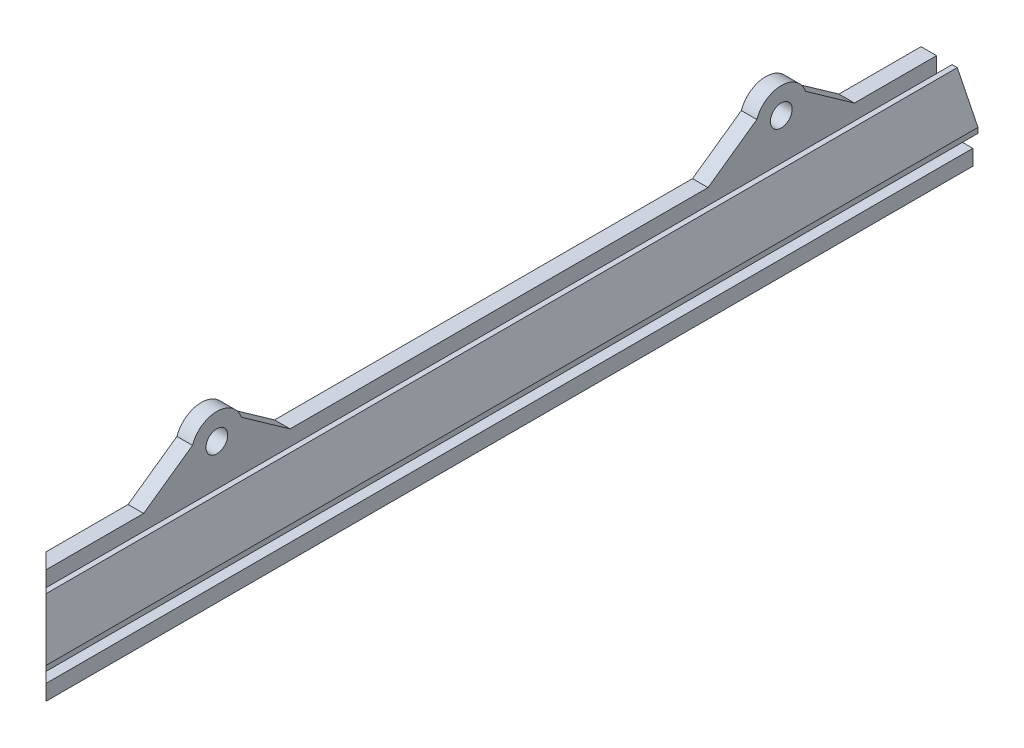
ISO-10303-21;
HEADER;
FILE_DESCRIPTION(('STEP AP214'),'2;1');
FILE_NAME('part.step','',(''),(''),'','','');
FILE_SCHEMA(('AUTOMOTIVE_DESIGN { 1 0 10303 214 1 1 1 1 }'));
ENDSEC;
DATA;
#1=APPLICATION_CONTEXT('core data for automotive mechanical design processes');
#2=APPLICATION_PROTOCOL_DEFINITION('international standard','automotive_design',2000,#1);
#3=PRODUCT_CONTEXT('',#1,'mechanical');
#4=PRODUCT('Part','Part','',(#3));
#5=PRODUCT_RELATED_PRODUCT_CATEGORY('part','',(#4));
#6=PRODUCT_DEFINITION_FORMATION('','',#4);
#7=PRODUCT_DEFINITION_CONTEXT('part definition',#1,'design');
#8=PRODUCT_DEFINITION('design','',#6,#7);
#9=PRODUCT_DEFINITION_SHAPE('','',#8);
#10=(LENGTH_UNIT() NAMED_UNIT(*) SI_UNIT(.MILLI.,.METRE.));
#11=(NAMED_UNIT(*) PLANE_ANGLE_UNIT() SI_UNIT($,.RADIAN.));
#12=(NAMED_UNIT(*) SI_UNIT($,.STERADIAN.) SOLID_ANGLE_UNIT());
#13=UNCERTAINTY_MEASURE_WITH_UNIT(LENGTH_MEASURE(1.E-05),#10,'distance_accuracy_value','');
#14=(GEOMETRIC_REPRESENTATION_CONTEXT(3) GLOBAL_UNCERTAINTY_ASSIGNED_CONTEXT((#13)) GLOBAL_UNIT_ASSIGNED_CONTEXT((#10,
#11,#12)) REPRESENTATION_CONTEXT('',''));
#15=CARTESIAN_POINT('',(0.,0.,0.));
#16=DIRECTION('',(0.,0.,1.));
#17=DIRECTION('',(1.,0.,0.));
#18=AXIS2_PLACEMENT_3D('',#15,#16,#17);
#19=CARTESIAN_POINT('',(0.,15.,180.));
#20=DIRECTION('',(0.,-1.,0.));
#21=DIRECTION('',(0.,0.,-1.));
#22=AXIS2_PLACEMENT_3D('',#19,#20,#21);
#23=PLANE('',#22);
#24=DIRECTION('',(0.,0.,-1.));
#25=VECTOR('',#24,1.);
#26=CARTESIAN_POINT('',(3.,15.,180.));
#27=LINE('',#26,#25);
#28=CARTESIAN_POINT('',(2.99999999999998,15.,172.));
#29=VERTEX_POINT('',#28);
#30=CARTESIAN_POINT('',(3.,15.,153.142135623731));
#31=VERTEX_POINT('',#30);
#32=EDGE_CURVE('E308',#29,#31,#27,.T.);
#33=ORIENTED_EDGE('',*,*,#32,.T.);
#34=DIRECTION('',(-1.,0.,0.));
#35=VECTOR('',#34,1.);
#36=CARTESIAN_POINT('',(0.,15.,153.142135623731));
#37=LINE('',#36,#35);
#38=CARTESIAN_POINT('',(0.,15.,153.142135623731));
#39=VERTEX_POINT('',#38);
#40=EDGE_CURVE('E239',#31,#39,#37,.T.);
#41=ORIENTED_EDGE('',*,*,#40,.T.);
#42=DIRECTION('',(0.,0.,-1.));
#43=VECTOR('',#42,1.);
#44=CARTESIAN_POINT('',(0.,15.,180.));
#45=LINE('',#44,#43);
#46=CARTESIAN_POINT('',(0.,15.,169.));
#47=VERTEX_POINT('',#46);
#48=EDGE_CURVE('E298',#47,#39,#45,.T.);
#49=ORIENTED_EDGE('',*,*,#48,.F.);
#50=DIRECTION('',(-0.707106781186551,0.,-0.707106781186544));
#51=VECTOR('',#50,1.);
#52=CARTESIAN_POINT('',(-84.5,15.,84.5000000000009));
#53=LINE('',#52,#51);
#54=EDGE_CURVE('E196',#29,#47,#53,.T.);
#55=ORIENTED_EDGE('',*,*,#54,.F.);
#56=EDGE_LOOP('',(#33,#41,#49,#55));
#57=FACE_BOUND('',#56,.T.);
#58=ADVANCED_FACE('F47',(#57),#23,.F.);
#59=CARTESIAN_POINT('',(0.,15.,124.857864376269));
#60=VERTEX_POINT('',#59);
#61=CARTESIAN_POINT('',(0.,15.,44.1421356237311));
#62=VERTEX_POINT('',#61);
#63=EDGE_CURVE('E295',#60,#62,#45,.T.);
#64=ORIENTED_EDGE('',*,*,#63,.F.);
#65=DIRECTION('',(1.,0.,0.));
#66=VECTOR('',#65,1.);
#67=CARTESIAN_POINT('',(0.,15.,124.857864376269));
#68=LINE('',#67,#66);
#69=CARTESIAN_POINT('',(3.,15.,124.857864376269));
#70=VERTEX_POINT('',#69);
#71=EDGE_CURVE('E224',#60,#70,#68,.T.);
#72=ORIENTED_EDGE('',*,*,#71,.T.);
#73=CARTESIAN_POINT('',(3.,15.,44.1421356237311));
#74=VERTEX_POINT('',#73);
#75=EDGE_CURVE('E307',#70,#74,#27,.T.);
#76=ORIENTED_EDGE('',*,*,#75,.T.);
#77=DIRECTION('',(-1.,0.,0.));
#78=VECTOR('',#77,1.);
#79=CARTESIAN_POINT('',(0.,15.,44.1421356237311));
#80=LINE('',#79,#78);
#81=EDGE_CURVE('E219',#74,#62,#80,.T.);
#82=ORIENTED_EDGE('',*,*,#81,.T.);
#83=EDGE_LOOP('',(#64,#72,#76,#82));
#84=FACE_BOUND('',#83,.T.);
#85=ADVANCED_FACE('F469',(#84),#23,.F.);
#86=CARTESIAN_POINT('',(0.,0.,180.));
#87=DIRECTION('',(1.,0.,0.));
#88=DIRECTION('',(0.,0.,-1.));
#89=AXIS2_PLACEMENT_3D('',#86,#87,#88);
#90=PLANE('',#89);
#91=ORIENTED_EDGE('',*,*,#48,.T.);
#92=DIRECTION('',(0.,0.577350269189619,-0.816496580927731));
#93=VECTOR('',#92,1.);
#94=CARTESIAN_POINT('',(0.,-2.66091868576533,178.118446353109));
#95=LINE('',#94,#93);
#96=CARTESIAN_POINT('',(0.,21.6666666666667,143.71404520791));
#97=VERTEX_POINT('',#96);
#98=EDGE_CURVE('E258',#39,#97,#95,.T.);
#99=ORIENTED_EDGE('',*,*,#98,.T.);
#100=CARTESIAN_POINT('',(0.,20.,139.));
#101=DIRECTION('',(-1.,0.,0.));
#102=DIRECTION('',(0.,0.,1.));
#103=AXIS2_PLACEMENT_3D('',#100,#101,#102);
#104=CIRCLE('',#103,4.99999999999998);
#105=CARTESIAN_POINT('',(0.,21.6666666666667,134.28595479209));
#106=VERTEX_POINT('',#105);
#107=EDGE_CURVE('E449',#97,#106,#104,.T.);
#108=ORIENTED_EDGE('',*,*,#107,.T.);
#109=DIRECTION('',(0.,0.577350269189619,0.816496580927731));
#110=VECTOR('',#109,1.);
#111=CARTESIAN_POINT('',(0.,35.994252019099,154.548220313558));
#112=LINE('',#111,#110);
#113=EDGE_CURVE('E255',#106,#60,#112,.F.);
#114=ORIENTED_EDGE('',*,*,#113,.T.);
#115=ORIENTED_EDGE('',*,*,#63,.T.);
#116=DIRECTION('',(0.,0.577350269189619,-0.816496580927731));
#117=VECTOR('',#116,1.);
#118=CARTESIAN_POINT('',(0.,-54.0440114519875,141.785113019777));
#119=LINE('',#118,#117);
#120=CARTESIAN_POINT('',(0.,21.6666666666667,34.7140452079103));
#121=VERTEX_POINT('',#120);
#122=EDGE_CURVE('E264',#62,#121,#119,.T.);
#123=ORIENTED_EDGE('',*,*,#122,.T.);
#124=CARTESIAN_POINT('',(0.,20.,30.));
#125=DIRECTION('',(-1.,0.,0.));
#126=DIRECTION('',(0.,0.,1.));
#127=AXIS2_PLACEMENT_3D('',#124,#125,#126);
#128=CIRCLE('',#127,5.);
#129=CARTESIAN_POINT('',(0.,21.6666666666667,25.2859547920897));
#130=VERTEX_POINT('',#129);
#131=EDGE_CURVE('E286',#121,#130,#128,.T.);
#132=ORIENTED_EDGE('',*,*,#131,.T.);
#133=DIRECTION('',(0.,0.577350269189619,0.816496580927731));
#134=VECTOR('',#133,1.);
#135=CARTESIAN_POINT('',(0.,87.3773447853212,118.214886980225));
#136=LINE('',#135,#134);
#137=CARTESIAN_POINT('',(0.,15.,15.8578643762689));
#138=VERTEX_POINT('',#137);
#139=EDGE_CURVE('E11',#130,#138,#136,.F.);
#140=ORIENTED_EDGE('',*,*,#139,.T.);
#141=CARTESIAN_POINT('',(0.,15.,0.));
#142=VERTEX_POINT('',#141);
#143=EDGE_CURVE('E291',#138,#142,#45,.T.);
#144=ORIENTED_EDGE('',*,*,#143,.T.);
#145=DIRECTION('',(0.,-1.,0.));
#146=VECTOR('',#145,1.);
#147=CARTESIAN_POINT('',(0.,0.,0.));
#148=LINE('',#147,#146);
#149=CARTESIAN_POINT('',(0.,0.,0.));
#150=VERTEX_POINT('',#149);
#151=EDGE_CURVE('E217',#142,#150,#148,.T.);
#152=ORIENTED_EDGE('',*,*,#151,.T.);
#153=DIRECTION('',(0.,0.,-1.));
#154=VECTOR('',#153,1.);
#155=CARTESIAN_POINT('',(0.,0.,180.));
#156=LINE('',#155,#154);
#157=CARTESIAN_POINT('',(0.,0.,169.));
#158=VERTEX_POINT('',#157);
#159=EDGE_CURVE('E207',#158,#150,#156,.T.);
#160=ORIENTED_EDGE('',*,*,#159,.F.);
#161=DIRECTION('',(0.,1.,0.));
#162=VECTOR('',#161,1.);
#163=CARTESIAN_POINT('',(0.,0.,169.));
#164=LINE('',#163,#162);
#165=EDGE_CURVE('E190',#158,#47,#164,.T.);
#166=ORIENTED_EDGE('',*,*,#165,.T.);
#167=EDGE_LOOP('',(#91,#99,#108,#114,#115,#123,#132,#140,#144,#152,#160,#166));
#168=FACE_BOUND('',#167,.T.);
#169=CARTESIAN_POINT('',(0.,20.,30.));
#170=DIRECTION('',(-1.,0.,0.));
#171=DIRECTION('',(0.,0.,1.));
#172=AXIS2_PLACEMENT_3D('',#169,#170,#171);
#173=CIRCLE('',#172,2.1);
#174=CARTESIAN_POINT('',(0.,20.,32.1));
#175=VERTEX_POINT('',#174);
#176=EDGE_CURVE('E437',#175,#175,#173,.T.);
#177=ORIENTED_EDGE('',*,*,#176,.F.);
#178=EDGE_LOOP('',(#177));
#179=FACE_BOUND('',#178,.T.);
#180=CARTESIAN_POINT('',(0.,20.,139.));
#181=DIRECTION('',(-1.,0.,0.));
#182=DIRECTION('',(0.,0.,1.));
#183=AXIS2_PLACEMENT_3D('',#180,#181,#182);
#184=CIRCLE('',#183,2.09999999999999);
#185=CARTESIAN_POINT('',(0.,20.,141.1));
#186=VERTEX_POINT('',#185);
#187=EDGE_CURVE('E441',#186,#186,#184,.T.);
#188=ORIENTED_EDGE('',*,*,#187,.F.);
#189=EDGE_LOOP('',(#188));
#190=FACE_BOUND('',#189,.T.);
#191=ADVANCED_FACE('F214',(#168,#179,#190),#90,.F.);
#192=CARTESIAN_POINT('',(0.,0.,180.));
#193=DIRECTION('',(0.,1.,0.));
#194=DIRECTION('',(0.,0.,1.));
#195=AXIS2_PLACEMENT_3D('',#192,#193,#194);
#196=PLANE('',#195);
#197=DIRECTION('',(0.,0.,-1.));
#198=VECTOR('',#197,1.);
#199=CARTESIAN_POINT('',(10.,0.,180.));
#200=LINE('',#199,#198);
#201=CARTESIAN_POINT('',(10.,0.,179.));
#202=VERTEX_POINT('',#201);
#203=CARTESIAN_POINT('',(10.,0.,0.));
#204=VERTEX_POINT('',#203);
#205=EDGE_CURVE('E209',#202,#204,#200,.T.);
#206=ORIENTED_EDGE('',*,*,#205,.F.);
#207=DIRECTION('',(-0.707106781186551,0.,-0.707106781186544));
#208=VECTOR('',#207,1.);
#209=CARTESIAN_POINT('',(-84.5,0.,84.5000000000009));
#210=LINE('',#209,#208);
#211=EDGE_CURVE('E193',#202,#158,#210,.T.);
#212=ORIENTED_EDGE('',*,*,#211,.T.);
#213=ORIENTED_EDGE('',*,*,#159,.T.);
#214=DIRECTION('',(1.,0.,0.));
#215=VECTOR('',#214,1.);
#216=CARTESIAN_POINT('',(0.,0.,0.));
#217=LINE('',#216,#215);
#218=EDGE_CURVE('E363',#150,#204,#217,.T.);
#219=ORIENTED_EDGE('',*,*,#218,.T.);
#220=EDGE_LOOP('',(#206,#212,#213,#219));
#221=FACE_BOUND('',#220,.T.);
#222=ADVANCED_FACE('F205',(#221),#196,.F.);
#223=CARTESIAN_POINT('',(10.,0.,180.));
#224=DIRECTION('',(-1.,0.,0.));
#225=DIRECTION('',(0.,0.,1.));
#226=AXIS2_PLACEMENT_3D('',#223,#224,#225);
#227=PLANE('',#226);
#228=DIRECTION('',(0.,0.,-1.));
#229=VECTOR('',#228,1.);
#230=CARTESIAN_POINT('',(10.,3.,180.));
#231=LINE('',#230,#229);
#232=CARTESIAN_POINT('',(10.,3.,179.));
#233=VERTEX_POINT('',#232);
#234=CARTESIAN_POINT('',(10.,3.,0.));
#235=VERTEX_POINT('',#234);
#236=EDGE_CURVE('E226',#233,#235,#231,.T.);
#237=ORIENTED_EDGE('',*,*,#236,.F.);
#238=DIRECTION('',(0.,-1.,0.));
#239=VECTOR('',#238,1.);
#240=CARTESIAN_POINT('',(10.,0.,179.));
#241=LINE('',#240,#239);
#242=EDGE_CURVE('E402',#233,#202,#241,.T.);
#243=ORIENTED_EDGE('',*,*,#242,.T.);
#244=ORIENTED_EDGE('',*,*,#205,.T.);
#245=DIRECTION('',(0.,1.,0.));
#246=VECTOR('',#245,1.);
#247=CARTESIAN_POINT('',(10.,0.,0.));
#248=LINE('',#247,#246);
#249=EDGE_CURVE('E359',#204,#235,#248,.T.);
#250=ORIENTED_EDGE('',*,*,#249,.T.);
#251=EDGE_LOOP('',(#237,#243,#244,#250));
#252=FACE_BOUND('',#251,.T.);
#253=ADVANCED_FACE('F360',(#252),#227,.F.);
#254=CARTESIAN_POINT('',(10.,3.,180.));
#255=DIRECTION('',(0.,-1.,0.));
#256=DIRECTION('',(1.,0.,0.));
#257=AXIS2_PLACEMENT_3D('',#254,#255,#256);
#258=PLANE('',#257);
#259=DIRECTION('',(0.,0.,-1.));
#260=VECTOR('',#259,1.);
#261=CARTESIAN_POINT('',(3.,3.,180.));
#262=LINE('',#261,#260);
#263=CARTESIAN_POINT('',(3.,3.,172.));
#264=VERTEX_POINT('',#263);
#265=CARTESIAN_POINT('',(3.,3.,0.));
#266=VERTEX_POINT('',#265);
#267=EDGE_CURVE('E343',#264,#266,#262,.T.);
#268=ORIENTED_EDGE('',*,*,#267,.F.);
#269=DIRECTION('',(0.707106781186551,0.,0.707106781186544));
#270=VECTOR('',#269,1.);
#271=CARTESIAN_POINT('',(10.5,3.,179.5));
#272=LINE('',#271,#270);
#273=EDGE_CURVE('E356',#264,#233,#272,.T.);
#274=ORIENTED_EDGE('',*,*,#273,.T.);
#275=ORIENTED_EDGE('',*,*,#236,.T.);
#276=DIRECTION('',(-1.,0.,0.));
#277=VECTOR('',#276,1.);
#278=CARTESIAN_POINT('',(10.,3.,0.));
#279=LINE('',#278,#277);
#280=EDGE_CURVE('E354',#235,#266,#279,.T.);
#281=ORIENTED_EDGE('',*,*,#280,.T.);
#282=EDGE_LOOP('',(#268,#274,#275,#281));
#283=FACE_BOUND('',#282,.T.);
#284=ADVANCED_FACE('F352',(#283),#258,.F.);
#285=CARTESIAN_POINT('',(3.,3.,180.));
#286=DIRECTION('',(-1.,0.,0.));
#287=DIRECTION('',(0.,-1.,0.));
#288=AXIS2_PLACEMENT_3D('',#285,#286,#287);
#289=PLANE('',#288);
#290=DIRECTION('',(0.,0.,-1.));
#291=VECTOR('',#290,1.);
#292=CARTESIAN_POINT('',(3.,6.,180.));
#293=LINE('',#292,#291);
#294=CARTESIAN_POINT('',(3.,6.,172.));
#295=VERTEX_POINT('',#294);
#296=CARTESIAN_POINT('',(3.,6.,0.));
#297=VERTEX_POINT('',#296);
#298=EDGE_CURVE('E340',#295,#297,#293,.T.);
#299=ORIENTED_EDGE('',*,*,#298,.F.);
#300=DIRECTION('',(0.,-1.,0.));
#301=VECTOR('',#300,1.);
#302=CARTESIAN_POINT('',(3.,3.,172.));
#303=LINE('',#302,#301);
#304=EDGE_CURVE('E410',#295,#264,#303,.T.);
#305=ORIENTED_EDGE('',*,*,#304,.T.);
#306=ORIENTED_EDGE('',*,*,#267,.T.);
#307=DIRECTION('',(0.,1.,0.));
#308=VECTOR('',#307,1.);
#309=CARTESIAN_POINT('',(3.,3.,0.));
#310=LINE('',#309,#308);
#311=EDGE_CURVE('E368',#266,#297,#310,.T.);
#312=ORIENTED_EDGE('',*,*,#311,.T.);
#313=EDGE_LOOP('',(#299,#305,#306,#312));
#314=FACE_BOUND('',#313,.T.);
#315=ADVANCED_FACE('F524',(#314),#289,.F.);
#316=CARTESIAN_POINT('',(3.,6.,180.));
#317=DIRECTION('',(0.,1.,0.));
#318=DIRECTION('',(-1.,0.,0.));
#319=AXIS2_PLACEMENT_3D('',#316,#317,#318);
#320=PLANE('',#319);
#321=DIRECTION('',(0.,0.,-1.));
#322=VECTOR('',#321,1.);
#323=CARTESIAN_POINT('',(11.,6.,180.));
#324=LINE('',#323,#322);
#325=CARTESIAN_POINT('',(11.,6.,180.));
#326=VERTEX_POINT('',#325);
#327=CARTESIAN_POINT('',(11.,6.,0.));
#328=VERTEX_POINT('',#327);
#329=EDGE_CURVE('E336',#326,#328,#324,.T.);
#330=ORIENTED_EDGE('',*,*,#329,.F.);
#331=DIRECTION('',(-0.707106781186551,0.,-0.707106781186544));
#332=VECTOR('',#331,1.);
#333=CARTESIAN_POINT('',(6.99999999999997,6.,176.));
#334=LINE('',#333,#332);
#335=EDGE_CURVE('E414',#326,#295,#334,.T.);
#336=ORIENTED_EDGE('',*,*,#335,.T.);
#337=ORIENTED_EDGE('',*,*,#298,.T.);
#338=DIRECTION('',(1.,0.,0.));
#339=VECTOR('',#338,1.);
#340=CARTESIAN_POINT('',(3.,6.,0.));
#341=LINE('',#340,#339);
#342=EDGE_CURVE('E372',#297,#328,#341,.T.);
#343=ORIENTED_EDGE('',*,*,#342,.T.);
#344=EDGE_LOOP('',(#330,#336,#337,#343));
#345=FACE_BOUND('',#344,.T.);
#346=ADVANCED_FACE('F520',(#345),#320,.F.);
#347=CARTESIAN_POINT('',(11.,7.,180.));
#348=DIRECTION('',(-1.,0.,0.));
#349=DIRECTION('',(0.,0.,1.));
#350=AXIS2_PLACEMENT_3D('',#347,#348,#349);
#351=PLANE('',#350);
#352=DIRECTION('',(0.,1.,0.));
#353=VECTOR('',#352,1.);
#354=CARTESIAN_POINT('',(11.,7.,0.));
#355=LINE('',#354,#353);
#356=CARTESIAN_POINT('',(11.,7.,0.));
#357=VERTEX_POINT('',#356);
#358=EDGE_CURVE('E378',#328,#357,#355,.T.);
#359=ORIENTED_EDGE('',*,*,#358,.T.);
#360=DIRECTION('',(0.,0.,-1.));
#361=VECTOR('',#360,1.);
#362=CARTESIAN_POINT('',(11.,7.,180.));
#363=LINE('',#362,#361);
#364=CARTESIAN_POINT('',(11.,7.,180.));
#365=VERTEX_POINT('',#364);
#366=EDGE_CURVE('E332',#365,#357,#363,.T.);
#367=ORIENTED_EDGE('',*,*,#366,.F.);
#368=DIRECTION('',(0.,1.,0.));
#369=VECTOR('',#368,1.);
#370=CARTESIAN_POINT('',(11.,7.,180.));
#371=LINE('',#370,#369);
#372=EDGE_CURVE('E296',#326,#365,#371,.T.);
#373=ORIENTED_EDGE('',*,*,#372,.F.);
#374=ORIENTED_EDGE('',*,*,#329,.T.);
#375=EDGE_LOOP('',(#359,#367,#373,#374));
#376=FACE_BOUND('',#375,.T.);
#377=ADVANCED_FACE('F516',(#376),#351,.F.);
#378=CARTESIAN_POINT('',(7.,15.,180.));
#379=DIRECTION('',(-0.894427190999916,-0.447213595499958,0.));
#380=DIRECTION('',(0.447213595499958,-0.894427190999916,0.));
#381=AXIS2_PLACEMENT_3D('',#378,#379,#380);
#382=PLANE('',#381);
#383=DIRECTION('',(0.,0.,-1.));
#384=VECTOR('',#383,1.);
#385=CARTESIAN_POINT('',(7.,15.,180.));
#386=LINE('',#385,#384);
#387=CARTESIAN_POINT('',(7.00000000000001,15.,176.));
#388=VERTEX_POINT('',#387);
#389=CARTESIAN_POINT('',(7.,15.,0.));
#390=VERTEX_POINT('',#389);
#391=EDGE_CURVE('E329',#388,#390,#386,.T.);
#392=ORIENTED_EDGE('',*,*,#391,.F.);
#393=DIRECTION('',(0.408248290463864,-0.816496580927727,0.408248290463859));
#394=VECTOR('',#393,1.);
#395=CARTESIAN_POINT('',(7.66666666666666,13.6666666666667,176.666666666667));
#396=LINE('',#395,#394);
#397=EDGE_CURVE('E418',#388,#365,#396,.T.);
#398=ORIENTED_EDGE('',*,*,#397,.T.);
#399=ORIENTED_EDGE('',*,*,#366,.T.);
#400=DIRECTION('',(-0.447213595499958,0.894427190999916,0.));
#401=VECTOR('',#400,1.);
#402=CARTESIAN_POINT('',(7.,15.,0.));
#403=LINE('',#402,#401);
#404=EDGE_CURVE('E381',#357,#390,#403,.T.);
#405=ORIENTED_EDGE('',*,*,#404,.T.);
#406=EDGE_LOOP('',(#392,#398,#399,#405));
#407=FACE_BOUND('',#406,.T.);
#408=ADVANCED_FACE('F512',(#407),#382,.F.);
#409=CARTESIAN_POINT('',(6.,15.,180.));
#410=DIRECTION('',(0.,-1.,0.));
#411=DIRECTION('',(0.,0.,-1.));
#412=AXIS2_PLACEMENT_3D('',#409,#410,#411);
#413=PLANE('',#412);
#414=DIRECTION('',(0.,0.,-1.));
#415=VECTOR('',#414,1.);
#416=CARTESIAN_POINT('',(6.,15.,180.));
#417=LINE('',#416,#415);
#418=CARTESIAN_POINT('',(6.00000000000002,15.,175.));
#419=VERTEX_POINT('',#418);
#420=CARTESIAN_POINT('',(6.,15.,0.));
#421=VERTEX_POINT('',#420);
#422=EDGE_CURVE('E324',#419,#421,#417,.T.);
#423=ORIENTED_EDGE('',*,*,#422,.F.);
#424=EDGE_CURVE('E211',#388,#419,#53,.T.);
#425=ORIENTED_EDGE('',*,*,#424,.F.);
#426=ORIENTED_EDGE('',*,*,#391,.T.);
#427=DIRECTION('',(-1.,0.,0.));
#428=VECTOR('',#427,1.);
#429=CARTESIAN_POINT('',(6.,15.,0.));
#430=LINE('',#429,#428);
#431=EDGE_CURVE('E385',#390,#421,#430,.T.);
#432=ORIENTED_EDGE('',*,*,#431,.T.);
#433=EDGE_LOOP('',(#423,#425,#426,#432));
#434=FACE_BOUND('',#433,.T.);
#435=ADVANCED_FACE('F508',(#434),#413,.F.);
#436=CARTESIAN_POINT('',(6.,9.,180.));
#437=DIRECTION('',(1.,0.,0.));
#438=DIRECTION('',(0.,0.,-1.));
#439=AXIS2_PLACEMENT_3D('',#436,#437,#438);
#440=PLANE('',#439);
#441=DIRECTION('',(0.,0.,-1.));
#442=VECTOR('',#441,1.);
#443=CARTESIAN_POINT('',(6.,9.,180.));
#444=LINE('',#443,#442);
#445=CARTESIAN_POINT('',(6.,9.,175.));
#446=VERTEX_POINT('',#445);
#447=CARTESIAN_POINT('',(6.,9.,0.));
#448=VERTEX_POINT('',#447);
#449=EDGE_CURVE('E319',#446,#448,#444,.T.);
#450=ORIENTED_EDGE('',*,*,#449,.F.);
#451=DIRECTION('',(0.,1.,0.));
#452=VECTOR('',#451,1.);
#453=CARTESIAN_POINT('',(6.,9.,175.));
#454=LINE('',#453,#452);
#455=EDGE_CURVE('E422',#446,#419,#454,.T.);
#456=ORIENTED_EDGE('',*,*,#455,.T.);
#457=ORIENTED_EDGE('',*,*,#422,.T.);
#458=DIRECTION('',(0.,-1.,0.));
#459=VECTOR('',#458,1.);
#460=CARTESIAN_POINT('',(6.,9.,0.));
#461=LINE('',#460,#459);
#462=EDGE_CURVE('E389',#421,#448,#461,.T.);
#463=ORIENTED_EDGE('',*,*,#462,.T.);
#464=EDGE_LOOP('',(#450,#456,#457,#463));
#465=FACE_BOUND('',#464,.T.);
#466=ADVANCED_FACE('F502',(#465),#440,.F.);
#467=CARTESIAN_POINT('',(3.,9.,180.));
#468=DIRECTION('',(0.,-1.,0.));
#469=DIRECTION('',(0.,0.,-1.));
#470=AXIS2_PLACEMENT_3D('',#467,#468,#469);
#471=PLANE('',#470);
#472=DIRECTION('',(0.,0.,-1.));
#473=VECTOR('',#472,1.);
#474=CARTESIAN_POINT('',(3.,9.,180.));
#475=LINE('',#474,#473);
#476=CARTESIAN_POINT('',(3.,9.,172.));
#477=VERTEX_POINT('',#476);
#478=CARTESIAN_POINT('',(3.,9.,0.));
#479=VERTEX_POINT('',#478);
#480=EDGE_CURVE('E314',#477,#479,#475,.T.);
#481=ORIENTED_EDGE('',*,*,#480,.F.);
#482=DIRECTION('',(0.707106781186551,0.,0.707106781186544));
#483=VECTOR('',#482,1.);
#484=CARTESIAN_POINT('',(6.99999999999998,9.,176.));
#485=LINE('',#484,#483);
#486=EDGE_CURVE('E426',#477,#446,#485,.T.);
#487=ORIENTED_EDGE('',*,*,#486,.T.);
#488=ORIENTED_EDGE('',*,*,#449,.T.);
#489=DIRECTION('',(-1.,0.,0.));
#490=VECTOR('',#489,1.);
#491=CARTESIAN_POINT('',(3.,9.,0.));
#492=LINE('',#491,#490);
#493=EDGE_CURVE('E393',#448,#479,#492,.T.);
#494=ORIENTED_EDGE('',*,*,#493,.T.);
#495=EDGE_LOOP('',(#481,#487,#488,#494));
#496=FACE_BOUND('',#495,.T.);
#497=ADVANCED_FACE('F497',(#496),#471,.F.);
#498=CARTESIAN_POINT('',(3.,15.,180.));
#499=DIRECTION('',(-1.,0.,0.));
#500=DIRECTION('',(0.,-1.,0.));
#501=AXIS2_PLACEMENT_3D('',#498,#499,#500);
#502=PLANE('',#501);
#503=ORIENTED_EDGE('',*,*,#75,.F.);
#504=DIRECTION('',(0.,-0.577350269189619,-0.816496580927731));
#505=VECTOR('',#504,1.);
#506=CARTESIAN_POINT('',(3.,40.9942520190988,161.619288125423));
#507=LINE('',#506,#505);
#508=CARTESIAN_POINT('',(3.,21.6666666666667,134.28595479209));
#509=VERTEX_POINT('',#508);
#510=EDGE_CURVE('E252',#70,#509,#507,.F.);
#511=ORIENTED_EDGE('',*,*,#510,.T.);
#512=CARTESIAN_POINT('',(3.,20.,139.));
#513=DIRECTION('',(-1.,0.,0.));
#514=DIRECTION('',(0.,0.,1.));
#515=AXIS2_PLACEMENT_3D('',#512,#513,#514);
#516=CIRCLE('',#515,4.99999999999998);
#517=CARTESIAN_POINT('',(3.,21.6666666666667,143.71404520791));
#518=VERTEX_POINT('',#517);
#519=EDGE_CURVE('E453',#518,#509,#516,.T.);
#520=ORIENTED_EDGE('',*,*,#519,.F.);
#521=DIRECTION('',(0.,-0.577350269189619,0.816496580927731));
#522=VECTOR('',#521,1.);
#523=CARTESIAN_POINT('',(3.,2.33908131423456,171.047378541244));
#524=LINE('',#523,#522);
#525=EDGE_CURVE('E261',#518,#31,#524,.T.);
#526=ORIENTED_EDGE('',*,*,#525,.T.);
#527=ORIENTED_EDGE('',*,*,#32,.F.);
#528=DIRECTION('',(0.,-1.,0.));
#529=VECTOR('',#528,1.);
#530=CARTESIAN_POINT('',(3.,15.,172.));
#531=LINE('',#530,#529);
#532=EDGE_CURVE('E201',#29,#477,#531,.T.);
#533=ORIENTED_EDGE('',*,*,#532,.T.);
#534=ORIENTED_EDGE('',*,*,#480,.T.);
#535=DIRECTION('',(0.,1.,0.));
#536=VECTOR('',#535,1.);
#537=CARTESIAN_POINT('',(3.,15.,0.));
#538=LINE('',#537,#536);
#539=CARTESIAN_POINT('',(3.,15.,0.));
#540=VERTEX_POINT('',#539);
#541=EDGE_CURVE('E396',#479,#540,#538,.T.);
#542=ORIENTED_EDGE('',*,*,#541,.T.);
#543=CARTESIAN_POINT('',(3.,15.,15.8578643762689));
#544=VERTEX_POINT('',#543);
#545=EDGE_CURVE('E280',#544,#540,#27,.T.);
#546=ORIENTED_EDGE('',*,*,#545,.F.);
#547=DIRECTION('',(0.,-0.577350269189619,-0.816496580927731));
#548=VECTOR('',#547,1.);
#549=CARTESIAN_POINT('',(2.99999999999999,92.377344785321,125.285954792091));
#550=LINE('',#549,#548);
#551=CARTESIAN_POINT('',(3.,21.6666666666667,25.2859547920897));
#552=VERTEX_POINT('',#551);
#553=EDGE_CURVE('E57',#544,#552,#550,.F.);
#554=ORIENTED_EDGE('',*,*,#553,.T.);
#555=CARTESIAN_POINT('',(3.,20.,30.));
#556=DIRECTION('',(-1.,0.,0.));
#557=DIRECTION('',(0.,0.,1.));
#558=AXIS2_PLACEMENT_3D('',#555,#556,#557);
#559=CIRCLE('',#558,5.);
#560=CARTESIAN_POINT('',(3.,21.6666666666667,34.7140452079103));
#561=VERTEX_POINT('',#560);
#562=EDGE_CURVE('E277',#561,#552,#559,.T.);
#563=ORIENTED_EDGE('',*,*,#562,.F.);
#564=DIRECTION('',(0.,-0.577350269189619,0.816496580927731));
#565=VECTOR('',#564,1.);
#566=CARTESIAN_POINT('',(3.00000000000001,-49.0440114519877,134.714045207911));
#567=LINE('',#566,#565);
#568=EDGE_CURVE('E267',#561,#74,#567,.T.);
#569=ORIENTED_EDGE('',*,*,#568,.T.);
#570=EDGE_LOOP('',(#503,#511,#520,#526,#527,#533,#534,#542,#546,#554,#563,#569));
#571=FACE_BOUND('',#570,.T.);
#572=CARTESIAN_POINT('',(3.,20.,30.));
#573=DIRECTION('',(-1.,0.,0.));
#574=DIRECTION('',(0.,0.,1.));
#575=AXIS2_PLACEMENT_3D('',#572,#573,#574);
#576=CIRCLE('',#575,2.1);
#577=CARTESIAN_POINT('',(3.,20.,32.1));
#578=VERTEX_POINT('',#577);
#579=EDGE_CURVE('E435',#578,#578,#576,.T.);
#580=ORIENTED_EDGE('',*,*,#579,.T.);
#581=EDGE_LOOP('',(#580));
#582=FACE_BOUND('',#581,.T.);
#583=CARTESIAN_POINT('',(3.,20.,139.));
#584=DIRECTION('',(-1.,0.,0.));
#585=DIRECTION('',(0.,0.,1.));
#586=AXIS2_PLACEMENT_3D('',#583,#584,#585);
#587=CIRCLE('',#586,2.09999999999999);
#588=CARTESIAN_POINT('',(3.,20.,141.1));
#589=VERTEX_POINT('',#588);
#590=EDGE_CURVE('E445',#589,#589,#587,.T.);
#591=ORIENTED_EDGE('',*,*,#590,.T.);
#592=EDGE_LOOP('',(#591));
#593=FACE_BOUND('',#592,.T.);
#594=ADVANCED_FACE('F275',(#571,#582,#593),#502,.F.);
#595=ORIENTED_EDGE('',*,*,#143,.F.);
#596=DIRECTION('',(1.,0.,0.));
#597=VECTOR('',#596,1.);
#598=CARTESIAN_POINT('',(0.,15.,15.8578643762689));
#599=LINE('',#598,#597);
#600=EDGE_CURVE('E249',#138,#544,#599,.T.);
#601=ORIENTED_EDGE('',*,*,#600,.T.);
#602=ORIENTED_EDGE('',*,*,#545,.T.);
#603=DIRECTION('',(-1.,0.,0.));
#604=VECTOR('',#603,1.);
#605=CARTESIAN_POINT('',(0.,15.,0.));
#606=LINE('',#605,#604);
#607=EDGE_CURVE('E293',#540,#142,#606,.T.);
#608=ORIENTED_EDGE('',*,*,#607,.T.);
#609=EDGE_LOOP('',(#595,#601,#602,#608));
#610=FACE_BOUND('',#609,.T.);
#611=ADVANCED_FACE('F289',(#610),#23,.F.);
#612=CARTESIAN_POINT('',(0.,0.,0.));
#613=DIRECTION('',(0.,0.,-1.));
#614=DIRECTION('',(-1.,0.,0.));
#615=AXIS2_PLACEMENT_3D('',#612,#613,#614);
#616=PLANE('',#615);
#617=ORIENTED_EDGE('',*,*,#151,.F.);
#618=ORIENTED_EDGE('',*,*,#607,.F.);
#619=ORIENTED_EDGE('',*,*,#541,.F.);
#620=ORIENTED_EDGE('',*,*,#493,.F.);
#621=ORIENTED_EDGE('',*,*,#462,.F.);
#622=ORIENTED_EDGE('',*,*,#431,.F.);
#623=ORIENTED_EDGE('',*,*,#404,.F.);
#624=ORIENTED_EDGE('',*,*,#358,.F.);
#625=ORIENTED_EDGE('',*,*,#342,.F.);
#626=ORIENTED_EDGE('',*,*,#311,.F.);
#627=ORIENTED_EDGE('',*,*,#280,.F.);
#628=ORIENTED_EDGE('',*,*,#249,.F.);
#629=ORIENTED_EDGE('',*,*,#218,.F.);
#630=EDGE_LOOP('',(#617,#618,#619,#620,#621,#622,#623,#624,#625,#626,#627,#628,#629));
#631=FACE_BOUND('',#630,.T.);
#632=ADVANCED_FACE('F365',(#631),#616,.T.);
#633=CARTESIAN_POINT('',(-84.5,0.,84.5000000000009));
#634=DIRECTION('',(0.707106781186544,0.,-0.707106781186551));
#635=DIRECTION('',(-0.707106781186551,0.,-0.707106781186544));
#636=AXIS2_PLACEMENT_3D('',#633,#634,#635);
#637=PLANE('',#636);
#638=ORIENTED_EDGE('',*,*,#273,.F.);
#639=ORIENTED_EDGE('',*,*,#304,.F.);
#640=ORIENTED_EDGE('',*,*,#335,.F.);
#641=ORIENTED_EDGE('',*,*,#372,.T.);
#642=ORIENTED_EDGE('',*,*,#397,.F.);
#643=ORIENTED_EDGE('',*,*,#424,.T.);
#644=ORIENTED_EDGE('',*,*,#455,.F.);
#645=ORIENTED_EDGE('',*,*,#486,.F.);
#646=ORIENTED_EDGE('',*,*,#532,.F.);
#647=ORIENTED_EDGE('',*,*,#54,.T.);
#648=ORIENTED_EDGE('',*,*,#165,.F.);
#649=ORIENTED_EDGE('',*,*,#211,.F.);
#650=ORIENTED_EDGE('',*,*,#242,.F.);
#651=EDGE_LOOP('',(#638,#639,#640,#641,#642,#643,#644,#645,#646,#647,#648,#649,#650));
#652=FACE_BOUND('',#651,.T.);
#653=ADVANCED_FACE('F192',(#652),#637,.F.);
#654=CARTESIAN_POINT('',(3.,20.,30.));
#655=DIRECTION('',(-1.,0.,0.));
#656=DIRECTION('',(0.,0.,1.));
#657=AXIS2_PLACEMENT_3D('',#654,#655,#656);
#658=CYLINDRICAL_SURFACE('',#657,5.);
#659=ORIENTED_EDGE('',*,*,#131,.F.);
#660=DIRECTION('',(-1.,0.,0.));
#661=VECTOR('',#660,1.);
#662=CARTESIAN_POINT('',(3.,21.6666666666667,34.7140452079103));
#663=LINE('',#662,#661);
#664=EDGE_CURVE('E246',#121,#561,#663,.F.);
#665=ORIENTED_EDGE('',*,*,#664,.T.);
#666=ORIENTED_EDGE('',*,*,#562,.T.);
#667=DIRECTION('',(-1.,0.,0.));
#668=VECTOR('',#667,1.);
#669=CARTESIAN_POINT('',(3.,21.6666666666667,25.2859547920897));
#670=LINE('',#669,#668);
#671=EDGE_CURVE('E243',#552,#130,#670,.T.);
#672=ORIENTED_EDGE('',*,*,#671,.T.);
#673=EDGE_LOOP('',(#659,#665,#666,#672));
#674=FACE_BOUND('',#673,.T.);
#675=ADVANCED_FACE('F283',(#674),#658,.T.);
#676=CARTESIAN_POINT('',(3.,20.,30.));
#677=DIRECTION('',(-1.,0.,0.));
#678=DIRECTION('',(0.,0.,1.));
#679=AXIS2_PLACEMENT_3D('',#676,#677,#678);
#680=CYLINDRICAL_SURFACE('',#679,2.1);
#681=ORIENTED_EDGE('',*,*,#579,.F.);
#682=EDGE_LOOP('',(#681));
#683=FACE_BOUND('',#682,.T.);
#684=ORIENTED_EDGE('',*,*,#176,.T.);
#685=EDGE_LOOP('',(#684));
#686=FACE_BOUND('',#685,.T.);
#687=ADVANCED_FACE('F557',(#683,#686),#680,.F.);
#688=CARTESIAN_POINT('',(3.,20.,139.));
#689=DIRECTION('',(-1.,0.,0.));
#690=DIRECTION('',(0.,0.,1.));
#691=AXIS2_PLACEMENT_3D('',#688,#689,#690);
#692=CYLINDRICAL_SURFACE('',#691,4.99999999999998);
#693=ORIENTED_EDGE('',*,*,#519,.T.);
#694=DIRECTION('',(-1.,0.,0.));
#695=VECTOR('',#694,1.);
#696=CARTESIAN_POINT('',(3.,21.6666666666667,134.28595479209));
#697=LINE('',#696,#695);
#698=EDGE_CURVE('E236',#509,#106,#697,.T.);
#699=ORIENTED_EDGE('',*,*,#698,.T.);
#700=ORIENTED_EDGE('',*,*,#107,.F.);
#701=DIRECTION('',(-1.,0.,0.));
#702=VECTOR('',#701,1.);
#703=CARTESIAN_POINT('',(3.,21.6666666666667,143.71404520791));
#704=LINE('',#703,#702);
#705=EDGE_CURVE('E233',#97,#518,#704,.F.);
#706=ORIENTED_EDGE('',*,*,#705,.T.);
#707=EDGE_LOOP('',(#693,#699,#700,#706));
#708=FACE_BOUND('',#707,.T.);
#709=ADVANCED_FACE('F551',(#708),#692,.T.);
#710=CARTESIAN_POINT('',(3.,20.,139.));
#711=DIRECTION('',(-1.,0.,0.));
#712=DIRECTION('',(0.,0.,1.));
#713=AXIS2_PLACEMENT_3D('',#710,#711,#712);
#714=CYLINDRICAL_SURFACE('',#713,2.09999999999999);
#715=ORIENTED_EDGE('',*,*,#590,.F.);
#716=EDGE_LOOP('',(#715));
#717=FACE_BOUND('',#716,.T.);
#718=ORIENTED_EDGE('',*,*,#187,.T.);
#719=EDGE_LOOP('',(#718));
#720=FACE_BOUND('',#719,.T.);
#721=ADVANCED_FACE('F541',(#717,#720),#714,.F.);
#722=CARTESIAN_POINT('',(3.,15.,124.857864376269));
#723=DIRECTION('',(0.,0.816496580927731,-0.577350269189619));
#724=DIRECTION('',(-1.,0.,0.));
#725=AXIS2_PLACEMENT_3D('',#722,#723,#724);
#726=PLANE('',#725);
#727=ORIENTED_EDGE('',*,*,#113,.F.);
#728=ORIENTED_EDGE('',*,*,#698,.F.);
#729=ORIENTED_EDGE('',*,*,#510,.F.);
#730=ORIENTED_EDGE('',*,*,#71,.F.);
#731=EDGE_LOOP('',(#727,#728,#729,#730));
#732=FACE_BOUND('',#731,.T.);
#733=ADVANCED_FACE('F467',(#732),#726,.T.);
#734=CARTESIAN_POINT('',(3.,15.,153.142135623731));
#735=DIRECTION('',(0.,-0.816496580927731,-0.577350269189619));
#736=DIRECTION('',(-1.,0.,0.));
#737=AXIS2_PLACEMENT_3D('',#734,#735,#736);
#738=PLANE('',#737);
#739=ORIENTED_EDGE('',*,*,#525,.F.);
#740=ORIENTED_EDGE('',*,*,#705,.F.);
#741=ORIENTED_EDGE('',*,*,#98,.F.);
#742=ORIENTED_EDGE('',*,*,#40,.F.);
#743=EDGE_LOOP('',(#739,#740,#741,#742));
#744=FACE_BOUND('',#743,.T.);
#745=ADVANCED_FACE('F475',(#744),#738,.F.);
#746=CARTESIAN_POINT('',(3.,15.,44.1421356237311));
#747=DIRECTION('',(0.,-0.816496580927731,-0.577350269189619));
#748=DIRECTION('',(-1.,0.,0.));
#749=AXIS2_PLACEMENT_3D('',#746,#747,#748);
#750=PLANE('',#749);
#751=ORIENTED_EDGE('',*,*,#568,.F.);
#752=ORIENTED_EDGE('',*,*,#664,.F.);
#753=ORIENTED_EDGE('',*,*,#122,.F.);
#754=ORIENTED_EDGE('',*,*,#81,.F.);
#755=EDGE_LOOP('',(#751,#752,#753,#754));
#756=FACE_BOUND('',#755,.T.);
#757=ADVANCED_FACE('F473',(#756),#750,.F.);
#758=CARTESIAN_POINT('',(3.,15.,15.8578643762689));
#759=DIRECTION('',(0.,0.816496580927731,-0.577350269189619));
#760=DIRECTION('',(-1.,0.,0.));
#761=AXIS2_PLACEMENT_3D('',#758,#759,#760);
#762=PLANE('',#761);
#763=ORIENTED_EDGE('',*,*,#139,.F.);
#764=ORIENTED_EDGE('',*,*,#671,.F.);
#765=ORIENTED_EDGE('',*,*,#553,.F.);
#766=ORIENTED_EDGE('',*,*,#600,.F.);
#767=EDGE_LOOP('',(#763,#764,#765,#766));
#768=FACE_BOUND('',#767,.T.);
#769=ADVANCED_FACE('F50',(#768),#762,.T.);
#770=CLOSED_SHELL('',(#58,#85,#191,#222,#253,#284,#315,#346,#377,#408,#435,#466,#497,#594,#611,
#632,#653,#675,#687,#709,#721,#733,#745,#757,#769));
#771=MANIFOLD_SOLID_BREP('B2',#770);
#772=ADVANCED_BREP_SHAPE_REPRESENTATION('',(#18,#771),#14);
#773=SHAPE_DEFINITION_REPRESENTATION(#9,#772);
ENDSEC;
END-ISO-10303-21;
